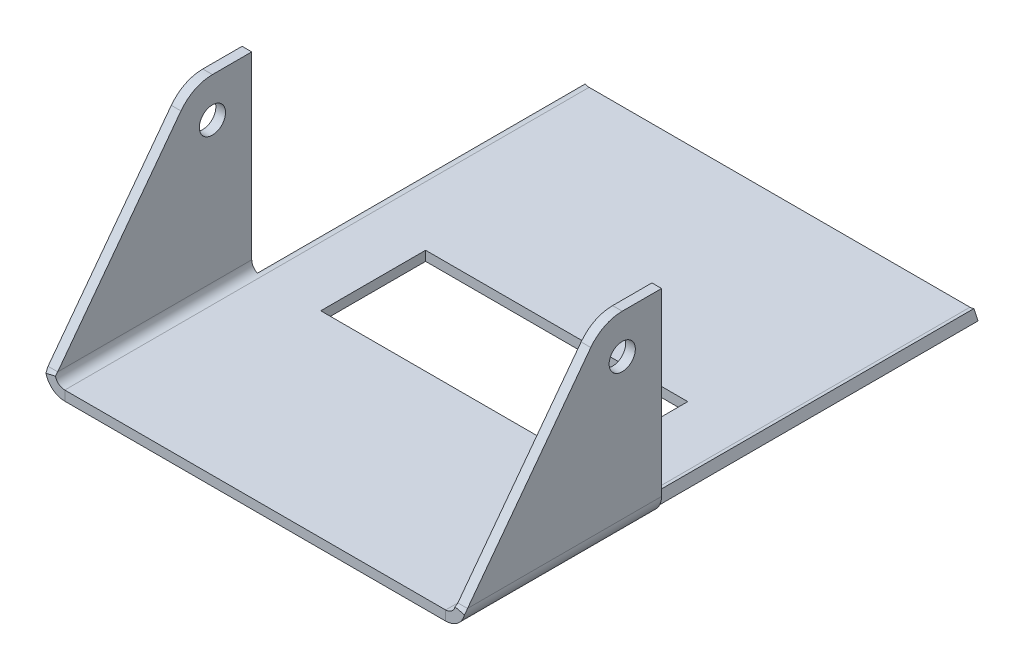
ISO-10303-21;
HEADER;
FILE_DESCRIPTION(('STEP AP214'),'2;1');
FILE_NAME('part.step','',(''),(''),'','','');
FILE_SCHEMA(('AUTOMOTIVE_DESIGN { 1 0 10303 214 1 1 1 1 }'));
ENDSEC;
DATA;
#1=APPLICATION_CONTEXT('core data for automotive mechanical design processes');
#2=APPLICATION_PROTOCOL_DEFINITION('international standard','automotive_design',2000,#1);
#3=PRODUCT_CONTEXT('',#1,'mechanical');
#4=PRODUCT('Part','Part','',(#3));
#5=PRODUCT_RELATED_PRODUCT_CATEGORY('part','',(#4));
#6=PRODUCT_DEFINITION_FORMATION('','',#4);
#7=PRODUCT_DEFINITION_CONTEXT('part definition',#1,'design');
#8=PRODUCT_DEFINITION('design','',#6,#7);
#9=PRODUCT_DEFINITION_SHAPE('','',#8);
#10=(LENGTH_UNIT() NAMED_UNIT(*) SI_UNIT(.MILLI.,.METRE.));
#11=(NAMED_UNIT(*) PLANE_ANGLE_UNIT() SI_UNIT($,.RADIAN.));
#12=(NAMED_UNIT(*) SI_UNIT($,.STERADIAN.) SOLID_ANGLE_UNIT());
#13=UNCERTAINTY_MEASURE_WITH_UNIT(LENGTH_MEASURE(1.E-05),#10,'distance_accuracy_value','');
#14=(GEOMETRIC_REPRESENTATION_CONTEXT(3) GLOBAL_UNCERTAINTY_ASSIGNED_CONTEXT((#13)) GLOBAL_UNIT_ASSIGNED_CONTEXT((#10,
#11,#12)) REPRESENTATION_CONTEXT('',''));
#15=CARTESIAN_POINT('',(0.,0.,0.));
#16=DIRECTION('',(0.,0.,1.));
#17=DIRECTION('',(1.,0.,0.));
#18=AXIS2_PLACEMENT_3D('',#15,#16,#17);
#19=CARTESIAN_POINT('',(27.,-0.7366,-12.));
#20=DIRECTION('',(0.,1.,0.));
#21=DIRECTION('',(0.,0.,1.));
#22=AXIS2_PLACEMENT_3D('',#19,#20,#21);
#23=PLANE('',#22);
#24=DIRECTION('',(-1.,0.,0.));
#25=VECTOR('',#24,1.);
#26=CARTESIAN_POINT('',(-10.,-0.7366,-23.));
#27=LINE('',#26,#25);
#28=CARTESIAN_POINT('',(10.,-0.7366,-23.));
#29=VERTEX_POINT('',#28);
#30=CARTESIAN_POINT('',(-10.,-0.7366,-23.));
#31=VERTEX_POINT('',#30);
#32=EDGE_CURVE('E539',#29,#31,#27,.T.);
#33=ORIENTED_EDGE('',*,*,#32,.T.);
#34=DIRECTION('',(0.,0.,1.));
#35=VECTOR('',#34,1.);
#36=CARTESIAN_POINT('',(-10.,-0.7366,-15.));
#37=LINE('',#36,#35);
#38=CARTESIAN_POINT('',(-10.,-0.7366,-15.));
#39=VERTEX_POINT('',#38);
#40=EDGE_CURVE('E536',#31,#39,#37,.T.);
#41=ORIENTED_EDGE('',*,*,#40,.T.);
#42=DIRECTION('',(1.,0.,0.));
#43=VECTOR('',#42,1.);
#44=CARTESIAN_POINT('',(-10.,-0.7366,-15.));
#45=LINE('',#44,#43);
#46=CARTESIAN_POINT('',(10.,-0.7366,-15.));
#47=VERTEX_POINT('',#46);
#48=EDGE_CURVE('E533',#39,#47,#45,.T.);
#49=ORIENTED_EDGE('',*,*,#48,.T.);
#50=DIRECTION('',(0.,0.,-1.));
#51=VECTOR('',#50,1.);
#52=CARTESIAN_POINT('',(10.,-0.7366,-15.));
#53=LINE('',#52,#51);
#54=EDGE_CURVE('E530',#47,#29,#53,.T.);
#55=ORIENTED_EDGE('',*,*,#54,.T.);
#56=EDGE_LOOP('',(#33,#41,#49,#55));
#57=FACE_BOUND('',#56,.T.);
#58=DIRECTION('',(-1.,0.,0.));
#59=VECTOR('',#58,1.);
#60=CARTESIAN_POINT('',(-15.,-0.7366,-40.));
#61=LINE('',#60,#59);
#62=CARTESIAN_POINT('',(14.5268,-0.7366,-40.));
#63=VERTEX_POINT('',#62);
#64=CARTESIAN_POINT('',(-14.5268,-0.7366,-40.));
#65=VERTEX_POINT('',#64);
#66=EDGE_CURVE('E529',#63,#65,#61,.T.);
#67=ORIENTED_EDGE('',*,*,#66,.F.);
#68=DIRECTION('',(0.,0.,1.));
#69=VECTOR('',#68,1.);
#70=CARTESIAN_POINT('',(14.5268,-0.7366,-12.));
#71=LINE('',#70,#69);
#72=CARTESIAN_POINT('',(14.5268,-0.7366,0.));
#73=VERTEX_POINT('',#72);
#74=EDGE_CURVE('E624',#63,#73,#71,.T.);
#75=ORIENTED_EDGE('',*,*,#74,.T.);
#76=DIRECTION('',(1.,0.,0.));
#77=VECTOR('',#76,1.);
#78=CARTESIAN_POINT('',(-16.,-0.7366,0.));
#79=LINE('',#78,#77);
#80=CARTESIAN_POINT('',(-14.5268,-0.7366,0.));
#81=VERTEX_POINT('',#80);
#82=EDGE_CURVE('E524',#81,#73,#79,.T.);
#83=ORIENTED_EDGE('',*,*,#82,.F.);
#84=DIRECTION('',(0.,0.,1.));
#85=VECTOR('',#84,1.);
#86=CARTESIAN_POINT('',(-14.5268,-0.7366,-12.));
#87=LINE('',#86,#85);
#88=EDGE_CURVE('E562',#65,#81,#87,.T.);
#89=ORIENTED_EDGE('',*,*,#88,.F.);
#90=EDGE_LOOP('',(#67,#75,#83,#89));
#91=FACE_BOUND('',#90,.T.);
#92=ADVANCED_FACE('F55',(#57,#91),#23,.F.);
#93=CARTESIAN_POINT('',(-16.0000000000002,-42.5257728614757,-12.));
#94=DIRECTION('',(1.,0.,0.));
#95=DIRECTION('',(0.,0.,1.));
#96=AXIS2_PLACEMENT_3D('',#93,#94,#95);
#97=PLANE('',#96);
#98=CARTESIAN_POINT('',(-16.,11.4742271385243,-12.));
#99=DIRECTION('',(1.,0.,0.));
#100=DIRECTION('',(0.,0.,1.));
#101=AXIS2_PLACEMENT_3D('',#98,#99,#100);
#102=CIRCLE('',#101,1.);
#103=CARTESIAN_POINT('',(-16.,11.4742271385243,-11.));
#104=VERTEX_POINT('',#103);
#105=EDGE_CURVE('E565',#104,#104,#102,.T.);
#106=ORIENTED_EDGE('',*,*,#105,.T.);
#107=EDGE_LOOP('',(#106));
#108=FACE_BOUND('',#107,.T.);
#109=DIRECTION('',(0.,1.,0.));
#110=VECTOR('',#109,1.);
#111=CARTESIAN_POINT('',(-16.,-0.525772861475685,-15.));
#112=LINE('',#111,#110);
#113=CARTESIAN_POINT('',(-16.,0.736600000000005,-15.));
#114=VERTEX_POINT('',#113);
#115=CARTESIAN_POINT('',(-16.,14.4742271385243,-15.));
#116=VERTEX_POINT('',#115);
#117=EDGE_CURVE('E576',#114,#116,#112,.T.);
#118=ORIENTED_EDGE('',*,*,#117,.F.);
#119=DIRECTION('',(0.,0.,1.));
#120=VECTOR('',#119,1.);
#121=CARTESIAN_POINT('',(-16.,0.736600000000002,-12.));
#122=LINE('',#121,#120);
#123=CARTESIAN_POINT('',(-16.,0.736599999999999,-0.196779646106759));
#124=VERTEX_POINT('',#123);
#125=EDGE_CURVE('E590',#114,#124,#122,.T.);
#126=ORIENTED_EDGE('',*,*,#125,.T.);
#127=DIRECTION('',(0.,-0.8,0.6));
#128=VECTOR('',#127,1.);
#129=CARTESIAN_POINT('',(-16.,13.2742271385243,-9.59999999999999));
#130=LINE('',#129,#128);
#131=CARTESIAN_POINT('',(-16.,13.2742271385243,-9.59999999999999));
#132=VERTEX_POINT('',#131);
#133=EDGE_CURVE('E587',#132,#124,#130,.T.);
#134=ORIENTED_EDGE('',*,*,#133,.F.);
#135=CARTESIAN_POINT('',(-16.,11.4742271385243,-12.));
#136=DIRECTION('',(1.,0.,0.));
#137=DIRECTION('',(0.,0.,-1.));
#138=AXIS2_PLACEMENT_3D('',#135,#136,#137);
#139=CIRCLE('',#138,3.);
#140=CARTESIAN_POINT('',(-16.,14.4742271385243,-12.));
#141=VERTEX_POINT('',#140);
#142=EDGE_CURVE('E575',#141,#132,#139,.T.);
#143=ORIENTED_EDGE('',*,*,#142,.F.);
#144=DIRECTION('',(0.,0.,1.));
#145=VECTOR('',#144,1.);
#146=CARTESIAN_POINT('',(-16.,14.4742271385243,-15.));
#147=LINE('',#146,#145);
#148=EDGE_CURVE('E572',#116,#141,#147,.T.);
#149=ORIENTED_EDGE('',*,*,#148,.F.);
#150=EDGE_LOOP('',(#118,#126,#134,#143,#149));
#151=FACE_BOUND('',#150,.T.);
#152=ADVANCED_FACE('F637',(#108,#151),#97,.F.);
#153=CARTESIAN_POINT('',(-16.,13.2742271385243,-9.59999999999999));
#154=DIRECTION('',(0.,0.6,0.8));
#155=DIRECTION('',(0.,-0.8,0.6));
#156=AXIS2_PLACEMENT_3D('',#153,#154,#155);
#157=PLANE('',#156);
#158=CARTESIAN_POINT('',(-15.2634,0.7366,-0.196779646106766));
#159=CARTESIAN_POINT('',(-16.,0.7366,-0.196779646106766));
#160=B_SPLINE_CURVE_WITH_KNOTS('',1,(#158,#159),.UNSPECIFIED.,.F.,.F.,(2,2),(0.,1.),.UNSPECIFIED.);
#161=CARTESIAN_POINT('',(-15.2634,0.736599999999998,-0.196779646106766));
#162=VERTEX_POINT('',#161);
#163=EDGE_CURVE('E609',#162,#124,#160,.T.);
#164=ORIENTED_EDGE('',*,*,#163,.F.);
#165=DIRECTION('',(0.,-0.8,0.6));
#166=VECTOR('',#165,1.);
#167=CARTESIAN_POINT('',(-15.2634,13.2742271385243,-9.59999999999999));
#168=LINE('',#167,#166);
#169=CARTESIAN_POINT('',(-15.2634,13.2742271385243,-9.59999999999999));
#170=VERTEX_POINT('',#169);
#171=EDGE_CURVE('E568',#170,#162,#168,.T.);
#172=ORIENTED_EDGE('',*,*,#171,.F.);
#173=DIRECTION('',(1.,0.,0.));
#174=VECTOR('',#173,1.);
#175=CARTESIAN_POINT('',(-16.,13.2742271385243,-9.59999999999999));
#176=LINE('',#175,#174);
#177=EDGE_CURVE('E588',#132,#170,#176,.T.);
#178=ORIENTED_EDGE('',*,*,#177,.F.);
#179=ORIENTED_EDGE('',*,*,#133,.T.);
#180=EDGE_LOOP('',(#164,#172,#178,#179));
#181=FACE_BOUND('',#180,.T.);
#182=ADVANCED_FACE('F626',(#181),#157,.T.);
#183=CARTESIAN_POINT('',(-16.,11.4742271385243,-12.));
#184=DIRECTION('',(1.,0.,0.));
#185=DIRECTION('',(0.,0.,1.));
#186=AXIS2_PLACEMENT_3D('',#183,#184,#185);
#187=CYLINDRICAL_SURFACE('',#186,3.);
#188=CARTESIAN_POINT('',(-15.2634,11.4742271385243,-12.));
#189=DIRECTION('',(1.,0.,0.));
#190=DIRECTION('',(0.,0.,-1.));
#191=AXIS2_PLACEMENT_3D('',#188,#189,#190);
#192=CIRCLE('',#191,3.);
#193=CARTESIAN_POINT('',(-15.2634,14.4742271385243,-12.));
#194=VERTEX_POINT('',#193);
#195=EDGE_CURVE('E583',#194,#170,#192,.T.);
#196=ORIENTED_EDGE('',*,*,#195,.F.);
#197=DIRECTION('',(1.,0.,0.));
#198=VECTOR('',#197,1.);
#199=CARTESIAN_POINT('',(-16.,14.4742271385243,-12.));
#200=LINE('',#199,#198);
#201=EDGE_CURVE('E591',#141,#194,#200,.T.);
#202=ORIENTED_EDGE('',*,*,#201,.F.);
#203=ORIENTED_EDGE('',*,*,#142,.T.);
#204=ORIENTED_EDGE('',*,*,#177,.T.);
#205=EDGE_LOOP('',(#196,#202,#203,#204));
#206=FACE_BOUND('',#205,.T.);
#207=ADVANCED_FACE('F636',(#206),#187,.T.);
#208=CARTESIAN_POINT('',(-16.,14.4742271385243,-15.));
#209=DIRECTION('',(0.,1.,0.));
#210=DIRECTION('',(0.,0.,1.));
#211=AXIS2_PLACEMENT_3D('',#208,#209,#210);
#212=PLANE('',#211);
#213=DIRECTION('',(0.,0.,1.));
#214=VECTOR('',#213,1.);
#215=CARTESIAN_POINT('',(-15.2634,14.4742271385243,-15.));
#216=LINE('',#215,#214);
#217=CARTESIAN_POINT('',(-15.2634,14.4742271385243,-15.));
#218=VERTEX_POINT('',#217);
#219=EDGE_CURVE('E580',#218,#194,#216,.T.);
#220=ORIENTED_EDGE('',*,*,#219,.F.);
#221=DIRECTION('',(1.,0.,0.));
#222=VECTOR('',#221,1.);
#223=CARTESIAN_POINT('',(-16.,14.4742271385243,-15.));
#224=LINE('',#223,#222);
#225=EDGE_CURVE('E579',#116,#218,#224,.T.);
#226=ORIENTED_EDGE('',*,*,#225,.F.);
#227=ORIENTED_EDGE('',*,*,#148,.T.);
#228=ORIENTED_EDGE('',*,*,#201,.T.);
#229=EDGE_LOOP('',(#220,#226,#227,#228));
#230=FACE_BOUND('',#229,.T.);
#231=ADVANCED_FACE('F736',(#230),#212,.T.);
#232=CARTESIAN_POINT('',(-16.,-0.525772861475685,-15.));
#233=DIRECTION('',(0.,0.,-1.));
#234=DIRECTION('',(0.,1.,0.));
#235=AXIS2_PLACEMENT_3D('',#232,#233,#234);
#236=PLANE('',#235);
#237=DIRECTION('',(1.,0.,0.));
#238=VECTOR('',#237,1.);
#239=CARTESIAN_POINT('',(-16.,0.736600000000006,-15.));
#240=LINE('',#239,#238);
#241=CARTESIAN_POINT('',(-15.2634,0.736600000000003,-15.));
#242=VERTEX_POINT('',#241);
#243=EDGE_CURVE('E595',#114,#242,#240,.T.);
#244=ORIENTED_EDGE('',*,*,#243,.F.);
#245=ORIENTED_EDGE('',*,*,#117,.T.);
#246=ORIENTED_EDGE('',*,*,#225,.T.);
#247=DIRECTION('',(0.,1.,0.));
#248=VECTOR('',#247,1.);
#249=CARTESIAN_POINT('',(-15.2634,-0.525772861475688,-15.));
#250=LINE('',#249,#248);
#251=EDGE_CURVE('E584',#242,#218,#250,.T.);
#252=ORIENTED_EDGE('',*,*,#251,.F.);
#253=EDGE_LOOP('',(#244,#245,#246,#252));
#254=FACE_BOUND('',#253,.T.);
#255=ADVANCED_FACE('F740',(#254),#236,.T.);
#256=CARTESIAN_POINT('',(-15.2634000000002,-42.5257728614757,-12.));
#257=DIRECTION('',(1.,0.,0.));
#258=DIRECTION('',(0.,0.,1.));
#259=AXIS2_PLACEMENT_3D('',#256,#257,#258);
#260=PLANE('',#259);
#261=DIRECTION('',(0.,0.,1.));
#262=VECTOR('',#261,1.);
#263=CARTESIAN_POINT('',(-15.2634,0.736599999999999,-12.));
#264=LINE('',#263,#262);
#265=EDGE_CURVE('E597',#242,#162,#264,.T.);
#266=ORIENTED_EDGE('',*,*,#265,.F.);
#267=ORIENTED_EDGE('',*,*,#251,.T.);
#268=ORIENTED_EDGE('',*,*,#219,.T.);
#269=ORIENTED_EDGE('',*,*,#195,.T.);
#270=ORIENTED_EDGE('',*,*,#171,.T.);
#271=EDGE_LOOP('',(#266,#267,#268,#269,#270));
#272=FACE_BOUND('',#271,.T.);
#273=CARTESIAN_POINT('',(-15.2634,11.4742271385243,-12.));
#274=DIRECTION('',(1.,0.,0.));
#275=DIRECTION('',(0.,0.,1.));
#276=AXIS2_PLACEMENT_3D('',#273,#274,#275);
#277=CIRCLE('',#276,1.);
#278=CARTESIAN_POINT('',(-15.2634,11.4742271385243,-11.));
#279=VERTEX_POINT('',#278);
#280=EDGE_CURVE('E569',#279,#279,#277,.T.);
#281=ORIENTED_EDGE('',*,*,#280,.F.);
#282=EDGE_LOOP('',(#281));
#283=FACE_BOUND('',#282,.T.);
#284=ADVANCED_FACE('F638',(#272,#283),#260,.T.);
#285=CARTESIAN_POINT('',(-16.,11.4742271385243,-12.));
#286=DIRECTION('',(1.,0.,0.));
#287=DIRECTION('',(0.,0.,1.));
#288=AXIS2_PLACEMENT_3D('',#285,#286,#287);
#289=CYLINDRICAL_SURFACE('',#288,1.);
#290=ORIENTED_EDGE('',*,*,#105,.F.);
#291=EDGE_LOOP('',(#290));
#292=FACE_BOUND('',#291,.T.);
#293=ORIENTED_EDGE('',*,*,#280,.T.);
#294=EDGE_LOOP('',(#293));
#295=FACE_BOUND('',#294,.T.);
#296=ADVANCED_FACE('F807',(#292,#295),#289,.F.);
#297=CARTESIAN_POINT('',(10.,-0.7366,-15.));
#298=DIRECTION('',(1.,0.,0.));
#299=DIRECTION('',(0.,0.,-1.));
#300=AXIS2_PLACEMENT_3D('',#297,#298,#299);
#301=PLANE('',#300);
#302=DIRECTION('',(0.,0.,-1.));
#303=VECTOR('',#302,1.);
#304=CARTESIAN_POINT('',(10.,0.,-15.));
#305=LINE('',#304,#303);
#306=CARTESIAN_POINT('',(10.,0.,-15.));
#307=VERTEX_POINT('',#306);
#308=CARTESIAN_POINT('',(10.,0.,-23.));
#309=VERTEX_POINT('',#308);
#310=EDGE_CURVE('E559',#307,#309,#305,.T.);
#311=ORIENTED_EDGE('',*,*,#310,.T.);
#312=DIRECTION('',(0.,1.,0.));
#313=VECTOR('',#312,1.);
#314=CARTESIAN_POINT('',(10.,-0.7366,-23.));
#315=LINE('',#314,#313);
#316=EDGE_CURVE('E542',#29,#309,#315,.T.);
#317=ORIENTED_EDGE('',*,*,#316,.F.);
#318=ORIENTED_EDGE('',*,*,#54,.F.);
#319=DIRECTION('',(0.,1.,0.));
#320=VECTOR('',#319,1.);
#321=CARTESIAN_POINT('',(10.,-0.7366,-15.));
#322=LINE('',#321,#320);
#323=EDGE_CURVE('E557',#47,#307,#322,.T.);
#324=ORIENTED_EDGE('',*,*,#323,.T.);
#325=EDGE_LOOP('',(#311,#317,#318,#324));
#326=FACE_BOUND('',#325,.T.);
#327=ADVANCED_FACE('F475',(#326),#301,.F.);
#328=CARTESIAN_POINT('',(-10.,-0.7366,-15.));
#329=DIRECTION('',(0.,0.,1.));
#330=DIRECTION('',(1.,0.,0.));
#331=AXIS2_PLACEMENT_3D('',#328,#329,#330);
#332=PLANE('',#331);
#333=DIRECTION('',(1.,0.,0.));
#334=VECTOR('',#333,1.);
#335=CARTESIAN_POINT('',(-10.,0.,-15.));
#336=LINE('',#335,#334);
#337=CARTESIAN_POINT('',(-10.,0.,-15.));
#338=VERTEX_POINT('',#337);
#339=EDGE_CURVE('E554',#338,#307,#336,.T.);
#340=ORIENTED_EDGE('',*,*,#339,.T.);
#341=ORIENTED_EDGE('',*,*,#323,.F.);
#342=ORIENTED_EDGE('',*,*,#48,.F.);
#343=DIRECTION('',(0.,1.,0.));
#344=VECTOR('',#343,1.);
#345=CARTESIAN_POINT('',(-10.,-0.7366,-15.));
#346=LINE('',#345,#344);
#347=EDGE_CURVE('E551',#39,#338,#346,.T.);
#348=ORIENTED_EDGE('',*,*,#347,.T.);
#349=EDGE_LOOP('',(#340,#341,#342,#348));
#350=FACE_BOUND('',#349,.T.);
#351=ADVANCED_FACE('F793',(#350),#332,.F.);
#352=CARTESIAN_POINT('',(-10.,-0.7366,-15.));
#353=DIRECTION('',(-1.,0.,0.));
#354=DIRECTION('',(0.,0.,1.));
#355=AXIS2_PLACEMENT_3D('',#352,#353,#354);
#356=PLANE('',#355);
#357=DIRECTION('',(0.,0.,1.));
#358=VECTOR('',#357,1.);
#359=CARTESIAN_POINT('',(-10.,0.,-15.));
#360=LINE('',#359,#358);
#361=CARTESIAN_POINT('',(-10.,0.,-23.));
#362=VERTEX_POINT('',#361);
#363=EDGE_CURVE('E549',#362,#338,#360,.T.);
#364=ORIENTED_EDGE('',*,*,#363,.T.);
#365=ORIENTED_EDGE('',*,*,#347,.F.);
#366=ORIENTED_EDGE('',*,*,#40,.F.);
#367=DIRECTION('',(0.,1.,0.));
#368=VECTOR('',#367,1.);
#369=CARTESIAN_POINT('',(-10.,-0.7366,-23.));
#370=LINE('',#369,#368);
#371=EDGE_CURVE('E547',#31,#362,#370,.T.);
#372=ORIENTED_EDGE('',*,*,#371,.T.);
#373=EDGE_LOOP('',(#364,#365,#366,#372));
#374=FACE_BOUND('',#373,.T.);
#375=ADVANCED_FACE('F785',(#374),#356,.F.);
#376=CARTESIAN_POINT('',(-10.,-0.7366,-23.));
#377=DIRECTION('',(0.,0.,-1.));
#378=DIRECTION('',(-1.,0.,0.));
#379=AXIS2_PLACEMENT_3D('',#376,#377,#378);
#380=PLANE('',#379);
#381=DIRECTION('',(-1.,0.,0.));
#382=VECTOR('',#381,1.);
#383=CARTESIAN_POINT('',(-10.,0.,-23.));
#384=LINE('',#383,#382);
#385=EDGE_CURVE('E544',#309,#362,#384,.T.);
#386=ORIENTED_EDGE('',*,*,#385,.T.);
#387=ORIENTED_EDGE('',*,*,#371,.F.);
#388=ORIENTED_EDGE('',*,*,#32,.F.);
#389=ORIENTED_EDGE('',*,*,#316,.T.);
#390=EDGE_LOOP('',(#386,#387,#388,#389));
#391=FACE_BOUND('',#390,.T.);
#392=ADVANCED_FACE('F643',(#391),#380,.F.);
#393=CARTESIAN_POINT('',(-15.,-0.7366,-40.));
#394=DIRECTION('',(0.,0.,-1.));
#395=DIRECTION('',(-1.,0.,0.));
#396=AXIS2_PLACEMENT_3D('',#393,#394,#395);
#397=PLANE('',#396);
#398=DIRECTION('',(0.,1.,0.));
#399=VECTOR('',#398,1.);
#400=CARTESIAN_POINT('',(14.5268,-0.7366,-40.));
#401=LINE('',#400,#399);
#402=CARTESIAN_POINT('',(14.5268,0.,-40.));
#403=VERTEX_POINT('',#402);
#404=EDGE_CURVE('E663',#63,#403,#401,.T.);
#405=ORIENTED_EDGE('',*,*,#404,.F.);
#406=ORIENTED_EDGE('',*,*,#66,.T.);
#407=DIRECTION('',(0.,1.,0.));
#408=VECTOR('',#407,1.);
#409=CARTESIAN_POINT('',(-14.5268,-0.7366,-40.));
#410=LINE('',#409,#408);
#411=CARTESIAN_POINT('',(-14.5268,0.,-40.));
#412=VERTEX_POINT('',#411);
#413=EDGE_CURVE('E527',#65,#412,#410,.T.);
#414=ORIENTED_EDGE('',*,*,#413,.T.);
#415=DIRECTION('',(-1.,0.,0.));
#416=VECTOR('',#415,1.);
#417=CARTESIAN_POINT('',(-15.,0.,-40.));
#418=LINE('',#417,#416);
#419=EDGE_CURVE('E82',#403,#412,#418,.T.);
#420=ORIENTED_EDGE('',*,*,#419,.F.);
#421=EDGE_LOOP('',(#405,#406,#414,#420));
#422=FACE_BOUND('',#421,.T.);
#423=ADVANCED_FACE('F640',(#422),#397,.T.);
#424=CARTESIAN_POINT('',(27.,0.,-12.));
#425=DIRECTION('',(0.,1.,0.));
#426=DIRECTION('',(0.,0.,1.));
#427=AXIS2_PLACEMENT_3D('',#424,#425,#426);
#428=PLANE('',#427);
#429=DIRECTION('',(0.,0.,1.));
#430=VECTOR('',#429,1.);
#431=CARTESIAN_POINT('',(14.5268,0.,-12.));
#432=LINE('',#431,#430);
#433=CARTESIAN_POINT('',(14.5268,0.,0.));
#434=VERTEX_POINT('',#433);
#435=EDGE_CURVE('E66',#403,#434,#432,.T.);
#436=ORIENTED_EDGE('',*,*,#435,.F.);
#437=ORIENTED_EDGE('',*,*,#419,.T.);
#438=DIRECTION('',(0.,0.,1.));
#439=VECTOR('',#438,1.);
#440=CARTESIAN_POINT('',(-14.5268,0.,-12.));
#441=LINE('',#440,#439);
#442=CARTESIAN_POINT('',(-14.5268,0.,0.));
#443=VERTEX_POINT('',#442);
#444=EDGE_CURVE('E525',#412,#443,#441,.T.);
#445=ORIENTED_EDGE('',*,*,#444,.T.);
#446=DIRECTION('',(1.,0.,0.));
#447=VECTOR('',#446,1.);
#448=CARTESIAN_POINT('',(-16.,0.,0.));
#449=LINE('',#448,#447);
#450=EDGE_CURVE('E74',#443,#434,#449,.T.);
#451=ORIENTED_EDGE('',*,*,#450,.T.);
#452=EDGE_LOOP('',(#436,#437,#445,#451));
#453=FACE_BOUND('',#452,.T.);
#454=ORIENTED_EDGE('',*,*,#363,.F.);
#455=ORIENTED_EDGE('',*,*,#385,.F.);
#456=ORIENTED_EDGE('',*,*,#310,.F.);
#457=ORIENTED_EDGE('',*,*,#339,.F.);
#458=EDGE_LOOP('',(#454,#455,#456,#457));
#459=FACE_BOUND('',#458,.T.);
#460=ADVANCED_FACE('F57',(#453,#459),#428,.T.);
#461=CARTESIAN_POINT('',(-16.,-0.7366,0.));
#462=DIRECTION('',(0.,0.,1.));
#463=DIRECTION('',(1.,0.,0.));
#464=AXIS2_PLACEMENT_3D('',#461,#462,#463);
#465=PLANE('',#464);
#466=DIRECTION('',(0.,-1.,0.));
#467=VECTOR('',#466,1.);
#468=CARTESIAN_POINT('',(14.5268,-0.7366,0.));
#469=LINE('',#468,#467);
#470=EDGE_CURVE('E12',#434,#73,#469,.T.);
#471=ORIENTED_EDGE('',*,*,#470,.F.);
#472=ORIENTED_EDGE('',*,*,#450,.F.);
#473=DIRECTION('',(0.,-1.,0.));
#474=VECTOR('',#473,1.);
#475=CARTESIAN_POINT('',(-14.5268,-0.7366,0.));
#476=LINE('',#475,#474);
#477=EDGE_CURVE('E516',#443,#81,#476,.T.);
#478=ORIENTED_EDGE('',*,*,#477,.T.);
#479=ORIENTED_EDGE('',*,*,#82,.T.);
#480=EDGE_LOOP('',(#471,#472,#478,#479));
#481=FACE_BOUND('',#480,.T.);
#482=ADVANCED_FACE('F644',(#481),#465,.T.);
#483=CARTESIAN_POINT('',(-14.5268,0.7366,-15.));
#484=DIRECTION('',(0.,0.,-1.));
#485=DIRECTION('',(-1.,0.,0.));
#486=AXIS2_PLACEMENT_3D('',#483,#484,#485);
#487=PLANE('',#486);
#488=ORIENTED_EDGE('',*,*,#243,.T.);
#489=CARTESIAN_POINT('',(-14.5268,0.7366,-15.));
#490=DIRECTION('',(0.,0.,-1.));
#491=DIRECTION('',(-1.,0.,0.));
#492=AXIS2_PLACEMENT_3D('',#489,#490,#491);
#493=CIRCLE('',#492,0.7366);
#494=CARTESIAN_POINT('',(-14.8327109778263,0.0665268445569861,-15.));
#495=VERTEX_POINT('',#494);
#496=EDGE_CURVE('E389',#242,#495,#493,.F.);
#497=ORIENTED_EDGE('',*,*,#496,.T.);
#498=DIRECTION('',(-0.41530135463793,-0.90968389280887,0.));
#499=VECTOR('',#498,1.);
#500=CARTESIAN_POINT('',(-15.1386219556526,-0.603546310886028,-15.));
#501=LINE('',#500,#499);
#502=CARTESIAN_POINT('',(-15.1386219556526,-0.603546310886028,-15.));
#503=VERTEX_POINT('',#502);
#504=EDGE_CURVE('E564',#495,#503,#501,.T.);
#505=ORIENTED_EDGE('',*,*,#504,.T.);
#506=CARTESIAN_POINT('',(-14.5268,0.7366,-15.));
#507=DIRECTION('',(0.,0.,1.));
#508=DIRECTION('',(-1.,0.,0.));
#509=AXIS2_PLACEMENT_3D('',#506,#507,#508);
#510=CIRCLE('',#509,1.4732);
#511=EDGE_CURVE('E391',#114,#503,#510,.T.);
#512=ORIENTED_EDGE('',*,*,#511,.F.);
#513=EDGE_LOOP('',(#488,#497,#505,#512));
#514=FACE_BOUND('',#513,.T.);
#515=ADVANCED_FACE('F473',(#514),#487,.T.);
#516=CARTESIAN_POINT('',(-15.1386219556526,-0.603546310886029,-27.5));
#517=DIRECTION('',(-0.909683892808871,0.415301354637928,0.));
#518=DIRECTION('',(0.,0.,-1.));
#519=AXIS2_PLACEMENT_3D('',#516,#517,#518);
#520=PLANE('',#519);
#521=ORIENTED_EDGE('',*,*,#504,.F.);
#522=DIRECTION('',(0.,0.,-1.));
#523=VECTOR('',#522,1.);
#524=CARTESIAN_POINT('',(-14.8327109778263,0.0665268445569855,20.0444102555836));
#525=LINE('',#524,#523);
#526=CARTESIAN_POINT('',(-14.8327109778263,0.0665268445569847,-40.));
#527=VERTEX_POINT('',#526);
#528=EDGE_CURVE('E406',#495,#527,#525,.T.);
#529=ORIENTED_EDGE('',*,*,#528,.T.);
#530=DIRECTION('',(-0.415301354637926,-0.909683892808872,0.));
#531=VECTOR('',#530,1.);
#532=CARTESIAN_POINT('',(-15.1386219556526,-0.60354631088603,-40.));
#533=LINE('',#532,#531);
#534=CARTESIAN_POINT('',(-15.1386219556526,-0.60354631088603,-40.));
#535=VERTEX_POINT('',#534);
#536=EDGE_CURVE('E747',#527,#535,#533,.T.);
#537=ORIENTED_EDGE('',*,*,#536,.T.);
#538=DIRECTION('',(0.,0.,-1.));
#539=VECTOR('',#538,1.);
#540=CARTESIAN_POINT('',(-15.1386219556526,-0.60354631088603,-40.));
#541=LINE('',#540,#539);
#542=EDGE_CURVE('E394',#503,#535,#541,.T.);
#543=ORIENTED_EDGE('',*,*,#542,.F.);
#544=EDGE_LOOP('',(#521,#529,#537,#543));
#545=FACE_BOUND('',#544,.T.);
#546=ADVANCED_FACE('F745',(#545),#520,.T.);
#547=CARTESIAN_POINT('',(-14.5268,0.7366,-40.));
#548=DIRECTION('',(0.,0.,-1.));
#549=DIRECTION('',(-1.,0.,0.));
#550=AXIS2_PLACEMENT_3D('',#547,#548,#549);
#551=PLANE('',#550);
#552=ORIENTED_EDGE('',*,*,#536,.F.);
#553=CARTESIAN_POINT('',(-14.5268,0.7366,-40.));
#554=DIRECTION('',(0.,0.,-1.));
#555=DIRECTION('',(-1.,0.,0.));
#556=AXIS2_PLACEMENT_3D('',#553,#554,#555);
#557=CIRCLE('',#556,0.7366);
#558=EDGE_CURVE('E402',#527,#412,#557,.F.);
#559=ORIENTED_EDGE('',*,*,#558,.T.);
#560=ORIENTED_EDGE('',*,*,#413,.F.);
#561=CARTESIAN_POINT('',(-14.5268,0.7366,-40.));
#562=DIRECTION('',(0.,0.,1.));
#563=DIRECTION('',(-1.,0.,0.));
#564=AXIS2_PLACEMENT_3D('',#561,#562,#563);
#565=CIRCLE('',#564,1.4732);
#566=EDGE_CURVE('E398',#535,#65,#565,.T.);
#567=ORIENTED_EDGE('',*,*,#566,.F.);
#568=EDGE_LOOP('',(#552,#559,#560,#567));
#569=FACE_BOUND('',#568,.T.);
#570=ADVANCED_FACE('F754',(#569),#551,.T.);
#571=CARTESIAN_POINT('',(-14.5268,0.7366,0.));
#572=DIRECTION('',(0.,0.,1.));
#573=DIRECTION('',(1.,0.,0.));
#574=AXIS2_PLACEMENT_3D('',#571,#572,#573);
#575=PLANE('',#574);
#576=ORIENTED_EDGE('',*,*,#477,.F.);
#577=CARTESIAN_POINT('',(-14.5268,0.7366,0.));
#578=DIRECTION('',(0.,0.,-1.));
#579=DIRECTION('',(-1.,0.,0.));
#580=AXIS2_PLACEMENT_3D('',#577,#578,#579);
#581=CIRCLE('',#580,0.7366);
#582=CARTESIAN_POINT('',(-15.2427294581442,0.563324003505018,0.));
#583=VERTEX_POINT('',#582);
#584=EDGE_CURVE('E405',#443,#583,#581,.T.);
#585=ORIENTED_EDGE('',*,*,#584,.T.);
#586=CARTESIAN_POINT('',(-15.9586589162884,0.390048007010035,0.));
#587=CARTESIAN_POINT('',(-15.2427294581442,0.563324003505017,0.));
#588=B_SPLINE_CURVE_WITH_KNOTS('',1,(#586,#587),.UNSPECIFIED.,.F.,.F.,(2,2),(0.,1.),.UNSPECIFIED.);
#589=CARTESIAN_POINT('',(-15.9586589162884,0.390048007010037,0.));
#590=VERTEX_POINT('',#589);
#591=EDGE_CURVE('E503',#583,#590,#588,.F.);
#592=ORIENTED_EDGE('',*,*,#591,.T.);
#593=CARTESIAN_POINT('',(-14.5268,0.7366,0.));
#594=DIRECTION('',(0.,0.,-1.));
#595=DIRECTION('',(1.,0.,0.));
#596=AXIS2_PLACEMENT_3D('',#593,#594,#595);
#597=CIRCLE('',#596,1.4732);
#598=EDGE_CURVE('E401',#81,#590,#597,.T.);
#599=ORIENTED_EDGE('',*,*,#598,.F.);
#600=EDGE_LOOP('',(#576,#585,#592,#599));
#601=FACE_BOUND('',#600,.T.);
#602=ADVANCED_FACE('F428',(#601),#575,.T.);
#603=CARTESIAN_POINT('',(-15.9586589162884,0.390048007010035,0.));
#604=CARTESIAN_POINT('',(-15.9860919140766,0.503393719278448,-0.0655977743655773));
#605=CARTESIAN_POINT('',(-16.,0.619981734461199,-0.131181871741189));
#606=CARTESIAN_POINT('',(-16.,0.7366,-0.196779646106766));
#607=CARTESIAN_POINT('',(-15.2427294581442,0.563324003505017,0.));
#608=CARTESIAN_POINT('',(-15.2564455720309,0.619995268892984,-0.0655959331064624));
#609=CARTESIAN_POINT('',(-15.2634,0.678292503905369,-0.131183713000304));
#610=CARTESIAN_POINT('',(-15.2634,0.7366,-0.196779646106766));
#611=B_SPLINE_SURFACE_WITH_KNOTS('',1,3,((#603,#604,#605,#606),(#607,#608,#609,#610)),
.UNSPECIFIED.,.F.,.F.,.F.,(2,2),(4,4),(0.,1.),(0.,1.),.UNSPECIFIED.);
#612=CARTESIAN_POINT('',(-15.2427294581442,0.563324003505017,0.));
#613=CARTESIAN_POINT('',(-15.2564455720309,0.619995268892984,-0.0655959331064624));
#614=CARTESIAN_POINT('',(-15.2634,0.678292503905369,-0.131183713000304));
#615=CARTESIAN_POINT('',(-15.2634,0.7366,-0.196779646106766));
#616=B_SPLINE_CURVE_WITH_KNOTS('',3,(#612,#613,#614,#615),.UNSPECIFIED.,.F.,.F.,(4,4),(0.,1.),.UNSPECIFIED.);
#617=EDGE_CURVE('E395',#583,#162,#616,.T.);
#618=CARTESIAN_POINT('',(-16.,0.7366,-0.196779646106766));
#619=CARTESIAN_POINT('',(-16.,0.619981734461199,-0.131181871741189));
#620=CARTESIAN_POINT('',(-15.9860919140766,0.503393719278448,-0.0655977743655773));
#621=CARTESIAN_POINT('',(-15.9586589162884,0.390048007010035,0.));
#622=B_SPLINE_CURVE_WITH_KNOTS('',3,(#618,#619,#620,#621),.UNSPECIFIED.,.F.,.F.,(4,4),(0.,1.),.UNSPECIFIED.);
#623=EDGE_CURVE('E455',#590,#124,#622,.F.);
#624=ORIENTED_EDGE('',*,*,#617,.T.);
#625=ORIENTED_EDGE('',*,*,#163,.T.);
#626=ORIENTED_EDGE('',*,*,#623,.F.);
#627=ORIENTED_EDGE('',*,*,#591,.F.);
#628=EDGE_LOOP('',(#624,#625,#626,#627));
#629=FACE_BOUND('',#628,.T.);
#630=ADVANCED_FACE('F426',(#629),#611,.T.);
#631=CARTESIAN_POINT('',(-14.5268,0.7366,20.0444102555836));
#632=DIRECTION('',(0.,0.,-1.));
#633=DIRECTION('',(-1.,0.,0.));
#634=AXIS2_PLACEMENT_3D('',#631,#632,#633);
#635=CYLINDRICAL_SURFACE('',#634,1.4732);
#636=ORIENTED_EDGE('',*,*,#598,.T.);
#637=ORIENTED_EDGE('',*,*,#623,.T.);
#638=ORIENTED_EDGE('',*,*,#125,.F.);
#639=ORIENTED_EDGE('',*,*,#511,.T.);
#640=ORIENTED_EDGE('',*,*,#542,.T.);
#641=ORIENTED_EDGE('',*,*,#566,.T.);
#642=ORIENTED_EDGE('',*,*,#88,.T.);
#643=EDGE_LOOP('',(#636,#637,#638,#639,#640,#641,#642));
#644=FACE_BOUND('',#643,.T.);
#645=ADVANCED_FACE('F416',(#644),#635,.T.);
#646=CARTESIAN_POINT('',(-14.5268,0.7366,20.0444102555836));
#647=DIRECTION('',(0.,0.,-1.));
#648=DIRECTION('',(-1.,0.,0.));
#649=AXIS2_PLACEMENT_3D('',#646,#647,#648);
#650=CYLINDRICAL_SURFACE('',#649,0.7366);
#651=ORIENTED_EDGE('',*,*,#584,.F.);
#652=ORIENTED_EDGE('',*,*,#444,.F.);
#653=ORIENTED_EDGE('',*,*,#558,.F.);
#654=ORIENTED_EDGE('',*,*,#528,.F.);
#655=ORIENTED_EDGE('',*,*,#496,.F.);
#656=ORIENTED_EDGE('',*,*,#265,.T.);
#657=ORIENTED_EDGE('',*,*,#617,.F.);
#658=EDGE_LOOP('',(#651,#652,#653,#654,#655,#656,#657));
#659=FACE_BOUND('',#658,.T.);
#660=ADVANCED_FACE('F425',(#659),#650,.F.);
#661=CARTESIAN_POINT('',(14.5268,0.7366,-15.));
#662=DIRECTION('',(0.,0.,-1.));
#663=DIRECTION('',(-1.,0.,0.));
#664=AXIS2_PLACEMENT_3D('',#661,#662,#663);
#665=PLANE('',#664);
#666=DIRECTION('',(0.41530135463793,-0.90968389280887,0.));
#667=VECTOR('',#666,1.);
#668=CARTESIAN_POINT('',(15.1386219556526,-0.603546310886028,-15.));
#669=LINE('',#668,#667);
#670=CARTESIAN_POINT('',(14.8327109778263,0.0665268445569861,-15.));
#671=VERTEX_POINT('',#670);
#672=CARTESIAN_POINT('',(15.1386219556526,-0.603546310886028,-15.));
#673=VERTEX_POINT('',#672);
#674=EDGE_CURVE('E382',#671,#673,#669,.T.);
#675=ORIENTED_EDGE('',*,*,#674,.F.);
#676=CARTESIAN_POINT('',(14.5268,0.7366,-15.));
#677=DIRECTION('',(0.,0.,1.));
#678=DIRECTION('',(1.,0.,0.));
#679=AXIS2_PLACEMENT_3D('',#676,#677,#678);
#680=CIRCLE('',#679,0.7366);
#681=CARTESIAN_POINT('',(15.2634,0.736600000000002,-15.));
#682=VERTEX_POINT('',#681);
#683=EDGE_CURVE('E239',#671,#682,#680,.T.);
#684=ORIENTED_EDGE('',*,*,#683,.T.);
#685=DIRECTION('',(-1.,0.,0.));
#686=VECTOR('',#685,1.);
#687=CARTESIAN_POINT('',(16.,0.736600000000006,-15.));
#688=LINE('',#687,#686);
#689=CARTESIAN_POINT('',(16.,0.736600000000006,-15.));
#690=VERTEX_POINT('',#689);
#691=EDGE_CURVE('E676',#690,#682,#688,.T.);
#692=ORIENTED_EDGE('',*,*,#691,.F.);
#693=CARTESIAN_POINT('',(14.5268,0.7366,-15.));
#694=DIRECTION('',(0.,0.,1.));
#695=DIRECTION('',(-1.,0.,0.));
#696=AXIS2_PLACEMENT_3D('',#693,#694,#695);
#697=CIRCLE('',#696,1.4732);
#698=EDGE_CURVE('E256',#673,#690,#697,.T.);
#699=ORIENTED_EDGE('',*,*,#698,.F.);
#700=EDGE_LOOP('',(#675,#684,#692,#699));
#701=FACE_BOUND('',#700,.T.);
#702=ADVANCED_FACE('F342',(#701),#665,.T.);
#703=CARTESIAN_POINT('',(16.,0.7366,-0.196779646106794));
#704=CARTESIAN_POINT('',(16.,0.619981734461196,-0.131181871741216));
#705=CARTESIAN_POINT('',(15.9860919140766,0.503393719278438,-0.0655977743656025));
#706=CARTESIAN_POINT('',(15.9586589162884,0.390048007010029,0.));
#707=CARTESIAN_POINT('',(15.2634,0.7366,-0.196779646106801));
#708=CARTESIAN_POINT('',(15.2634,0.678292503905363,-0.131183713000334));
#709=CARTESIAN_POINT('',(15.2564455720309,0.61999526889298,-0.0655959331064958));
#710=CARTESIAN_POINT('',(15.2427294581442,0.563324003505014,0.));
#711=B_SPLINE_SURFACE_WITH_KNOTS('',1,3,((#703,#704,#705,#706),(#707,#708,#709,#710)),
.UNSPECIFIED.,.F.,.F.,.F.,(2,2),(4,4),(0.,1.),(0.,1.),.UNSPECIFIED.);
#712=CARTESIAN_POINT('',(16.,0.7366,-0.196779646106794));
#713=CARTESIAN_POINT('',(15.2634,0.7366,-0.196779646106801));
#714=B_SPLINE_CURVE_WITH_KNOTS('',1,(#712,#713),.UNSPECIFIED.,.F.,.F.,(2,2),(0.,1.),.UNSPECIFIED.);
#715=CARTESIAN_POINT('',(15.2634,0.736600000000002,-0.196779646106767));
#716=VERTEX_POINT('',#715);
#717=CARTESIAN_POINT('',(16.,0.736600000000003,-0.19677964610678));
#718=VERTEX_POINT('',#717);
#719=EDGE_CURVE('E228',#716,#718,#714,.F.);
#720=CARTESIAN_POINT('',(15.2634,0.7366,-0.196779646106801));
#721=CARTESIAN_POINT('',(15.2634,0.678292503905363,-0.131183713000334));
#722=CARTESIAN_POINT('',(15.2564455720309,0.61999526889298,-0.0655959331064958));
#723=CARTESIAN_POINT('',(15.2427294581442,0.563324003505014,0.));
#724=B_SPLINE_CURVE_WITH_KNOTS('',3,(#720,#721,#722,#723),.UNSPECIFIED.,.F.,.F.,(4,4),(0.,1.),.UNSPECIFIED.);
#725=CARTESIAN_POINT('',(15.2427294581442,0.563324003505015,0.));
#726=VERTEX_POINT('',#725);
#727=EDGE_CURVE('E275',#716,#726,#724,.T.);
#728=CARTESIAN_POINT('',(15.2427294581442,0.563324003505014,0.));
#729=CARTESIAN_POINT('',(15.9586589162884,0.390048007010029,0.));
#730=B_SPLINE_CURVE_WITH_KNOTS('',1,(#728,#729),.UNSPECIFIED.,.F.,.F.,(2,2),(0.,1.),.UNSPECIFIED.);
#731=CARTESIAN_POINT('',(15.9586589162884,0.390048007010029,0.));
#732=VERTEX_POINT('',#731);
#733=EDGE_CURVE('E369',#726,#732,#730,.T.);
#734=CARTESIAN_POINT('',(15.9586589162884,0.390048007010029,0.));
#735=CARTESIAN_POINT('',(15.9860919140766,0.503393719278438,-0.0655977743656025));
#736=CARTESIAN_POINT('',(16.,0.619981734461196,-0.131181871741216));
#737=CARTESIAN_POINT('',(16.,0.7366,-0.196779646106794));
#738=B_SPLINE_CURVE_WITH_KNOTS('',3,(#734,#735,#736,#737),.UNSPECIFIED.,.F.,.F.,(4,4),(0.,1.),.UNSPECIFIED.);
#739=EDGE_CURVE('E259',#718,#732,#738,.F.);
#740=ORIENTED_EDGE('',*,*,#719,.F.);
#741=ORIENTED_EDGE('',*,*,#727,.T.);
#742=ORIENTED_EDGE('',*,*,#733,.T.);
#743=ORIENTED_EDGE('',*,*,#739,.F.);
#744=EDGE_LOOP('',(#740,#741,#742,#743));
#745=FACE_BOUND('',#744,.T.);
#746=ADVANCED_FACE('F330',(#745),#711,.T.);
#747=CARTESIAN_POINT('',(14.5268,0.7366,0.));
#748=DIRECTION('',(0.,0.,1.));
#749=DIRECTION('',(0.,-1.,0.));
#750=AXIS2_PLACEMENT_3D('',#747,#748,#749);
#751=PLANE('',#750);
#752=ORIENTED_EDGE('',*,*,#733,.F.);
#753=CARTESIAN_POINT('',(14.5268,0.7366,0.));
#754=DIRECTION('',(0.,0.,1.));
#755=DIRECTION('',(1.,0.,0.));
#756=AXIS2_PLACEMENT_3D('',#753,#754,#755);
#757=CIRCLE('',#756,0.7366);
#758=EDGE_CURVE('E272',#726,#434,#757,.F.);
#759=ORIENTED_EDGE('',*,*,#758,.T.);
#760=ORIENTED_EDGE('',*,*,#470,.T.);
#761=CARTESIAN_POINT('',(14.5268,0.7366,0.));
#762=DIRECTION('',(0.,0.,-1.));
#763=DIRECTION('',(0.,-1.,0.));
#764=AXIS2_PLACEMENT_3D('',#761,#762,#763);
#765=CIRCLE('',#764,1.4732);
#766=EDGE_CURVE('E265',#732,#73,#765,.T.);
#767=ORIENTED_EDGE('',*,*,#766,.F.);
#768=EDGE_LOOP('',(#752,#759,#760,#767));
#769=FACE_BOUND('',#768,.T.);
#770=ADVANCED_FACE('F341',(#769),#751,.T.);
#771=CARTESIAN_POINT('',(14.5268,0.7366,-40.));
#772=DIRECTION('',(0.,0.,-1.));
#773=DIRECTION('',(-1.,0.,0.));
#774=AXIS2_PLACEMENT_3D('',#771,#772,#773);
#775=PLANE('',#774);
#776=ORIENTED_EDGE('',*,*,#404,.T.);
#777=CARTESIAN_POINT('',(14.5268,0.7366,-40.));
#778=DIRECTION('',(0.,0.,1.));
#779=DIRECTION('',(1.,0.,0.));
#780=AXIS2_PLACEMENT_3D('',#777,#778,#779);
#781=CIRCLE('',#780,0.7366);
#782=CARTESIAN_POINT('',(14.8327109778263,0.0665268445569861,-40.));
#783=VERTEX_POINT('',#782);
#784=EDGE_CURVE('E269',#403,#783,#781,.T.);
#785=ORIENTED_EDGE('',*,*,#784,.T.);
#786=DIRECTION('',(0.41530135463793,-0.90968389280887,0.));
#787=VECTOR('',#786,1.);
#788=CARTESIAN_POINT('',(15.1386219556526,-0.603546310886027,-40.));
#789=LINE('',#788,#787);
#790=CARTESIAN_POINT('',(15.1386219556526,-0.603546310886027,-40.));
#791=VERTEX_POINT('',#790);
#792=EDGE_CURVE('E268',#783,#791,#789,.T.);
#793=ORIENTED_EDGE('',*,*,#792,.T.);
#794=CARTESIAN_POINT('',(14.5268,0.7366,-40.));
#795=DIRECTION('',(0.,0.,1.));
#796=DIRECTION('',(-1.,0.,0.));
#797=AXIS2_PLACEMENT_3D('',#794,#795,#796);
#798=CIRCLE('',#797,1.4732);
#799=EDGE_CURVE('E261',#63,#791,#798,.T.);
#800=ORIENTED_EDGE('',*,*,#799,.F.);
#801=EDGE_LOOP('',(#776,#785,#793,#800));
#802=FACE_BOUND('',#801,.T.);
#803=ADVANCED_FACE('F300',(#802),#775,.T.);
#804=CARTESIAN_POINT('',(15.1386219556526,-0.603546310886028,-27.5));
#805=DIRECTION('',(0.90968389280887,0.41530135463793,0.));
#806=DIRECTION('',(0.,0.,1.));
#807=AXIS2_PLACEMENT_3D('',#804,#805,#806);
#808=PLANE('',#807);
#809=DIRECTION('',(0.,0.,1.));
#810=VECTOR('',#809,1.);
#811=CARTESIAN_POINT('',(14.8327109778263,0.0665268445569861,-60.0444102555836));
#812=LINE('',#811,#810);
#813=EDGE_CURVE('E260',#783,#671,#812,.T.);
#814=ORIENTED_EDGE('',*,*,#813,.T.);
#815=ORIENTED_EDGE('',*,*,#674,.T.);
#816=DIRECTION('',(0.,0.,1.));
#817=VECTOR('',#816,1.);
#818=CARTESIAN_POINT('',(15.1386219556526,-0.603546310886028,-15.));
#819=LINE('',#818,#817);
#820=EDGE_CURVE('E264',#791,#673,#819,.T.);
#821=ORIENTED_EDGE('',*,*,#820,.F.);
#822=ORIENTED_EDGE('',*,*,#792,.F.);
#823=EDGE_LOOP('',(#814,#815,#821,#822));
#824=FACE_BOUND('',#823,.T.);
#825=ADVANCED_FACE('F298',(#824),#808,.T.);
#826=CARTESIAN_POINT('',(14.5268,0.7366,-60.0444102555836));
#827=DIRECTION('',(0.,0.,1.));
#828=DIRECTION('',(1.,0.,0.));
#829=AXIS2_PLACEMENT_3D('',#826,#827,#828);
#830=CYLINDRICAL_SURFACE('',#829,1.4732);
#831=ORIENTED_EDGE('',*,*,#799,.T.);
#832=ORIENTED_EDGE('',*,*,#820,.T.);
#833=ORIENTED_EDGE('',*,*,#698,.T.);
#834=DIRECTION('',(0.,0.,1.));
#835=VECTOR('',#834,1.);
#836=CARTESIAN_POINT('',(16.,0.736600000000006,-12.));
#837=LINE('',#836,#835);
#838=EDGE_CURVE('E252',#690,#718,#837,.T.);
#839=ORIENTED_EDGE('',*,*,#838,.T.);
#840=ORIENTED_EDGE('',*,*,#739,.T.);
#841=ORIENTED_EDGE('',*,*,#766,.T.);
#842=ORIENTED_EDGE('',*,*,#74,.F.);
#843=EDGE_LOOP('',(#831,#832,#833,#839,#840,#841,#842));
#844=FACE_BOUND('',#843,.T.);
#845=ADVANCED_FACE('F288',(#844),#830,.T.);
#846=CARTESIAN_POINT('',(14.5268,0.7366,-60.0444102555836));
#847=DIRECTION('',(0.,0.,1.));
#848=DIRECTION('',(1.,0.,0.));
#849=AXIS2_PLACEMENT_3D('',#846,#847,#848);
#850=CYLINDRICAL_SURFACE('',#849,0.7366);
#851=ORIENTED_EDGE('',*,*,#784,.F.);
#852=ORIENTED_EDGE('',*,*,#435,.T.);
#853=ORIENTED_EDGE('',*,*,#758,.F.);
#854=ORIENTED_EDGE('',*,*,#727,.F.);
#855=DIRECTION('',(0.,0.,1.));
#856=VECTOR('',#855,1.);
#857=CARTESIAN_POINT('',(15.2634,0.736600000000002,-12.));
#858=LINE('',#857,#856);
#859=EDGE_CURVE('E684',#682,#716,#858,.T.);
#860=ORIENTED_EDGE('',*,*,#859,.F.);
#861=ORIENTED_EDGE('',*,*,#683,.F.);
#862=ORIENTED_EDGE('',*,*,#813,.F.);
#863=EDGE_LOOP('',(#851,#852,#853,#854,#860,#861,#862));
#864=FACE_BOUND('',#863,.T.);
#865=ADVANCED_FACE('F297',(#864),#850,.F.);
#866=CARTESIAN_POINT('',(16.,11.4742271385243,-12.));
#867=DIRECTION('',(-1.,0.,0.));
#868=DIRECTION('',(0.,0.,1.));
#869=AXIS2_PLACEMENT_3D('',#866,#867,#868);
#870=CYLINDRICAL_SURFACE('',#869,1.);
#871=CARTESIAN_POINT('',(16.,11.4742271385243,-12.));
#872=DIRECTION('',(-1.,0.,0.));
#873=DIRECTION('',(0.,0.,1.));
#874=AXIS2_PLACEMENT_3D('',#871,#872,#873);
#875=CIRCLE('',#874,1.);
#876=CARTESIAN_POINT('',(16.,11.4742271385243,-11.));
#877=VERTEX_POINT('',#876);
#878=EDGE_CURVE('E686',#877,#877,#875,.T.);
#879=ORIENTED_EDGE('',*,*,#878,.F.);
#880=EDGE_LOOP('',(#879));
#881=FACE_BOUND('',#880,.T.);
#882=CARTESIAN_POINT('',(15.2634,11.4742271385243,-12.));
#883=DIRECTION('',(-1.,0.,0.));
#884=DIRECTION('',(0.,0.,1.));
#885=AXIS2_PLACEMENT_3D('',#882,#883,#884);
#886=CIRCLE('',#885,1.);
#887=CARTESIAN_POINT('',(15.2634,11.4742271385243,-11.));
#888=VERTEX_POINT('',#887);
#889=EDGE_CURVE('E248',#888,#888,#886,.T.);
#890=ORIENTED_EDGE('',*,*,#889,.T.);
#891=EDGE_LOOP('',(#890));
#892=FACE_BOUND('',#891,.T.);
#893=ADVANCED_FACE('F306',(#881,#892),#870,.F.);
#894=CARTESIAN_POINT('',(16.,11.4742271385243,-12.));
#895=DIRECTION('',(-1.,0.,0.));
#896=DIRECTION('',(0.,0.,1.));
#897=AXIS2_PLACEMENT_3D('',#894,#895,#896);
#898=CYLINDRICAL_SURFACE('',#897,3.00000000000001);
#899=CARTESIAN_POINT('',(15.2634,11.4742271385243,-12.));
#900=DIRECTION('',(-1.,0.,0.));
#901=DIRECTION('',(0.,0.,1.));
#902=AXIS2_PLACEMENT_3D('',#899,#900,#901);
#903=CIRCLE('',#902,3.00000000000001);
#904=CARTESIAN_POINT('',(15.2634,13.2742271385243,-9.59999999999999));
#905=VERTEX_POINT('',#904);
#906=CARTESIAN_POINT('',(15.2634,14.4742271385243,-12.));
#907=VERTEX_POINT('',#906);
#908=EDGE_CURVE('E238',#905,#907,#903,.T.);
#909=ORIENTED_EDGE('',*,*,#908,.F.);
#910=DIRECTION('',(-1.,0.,0.));
#911=VECTOR('',#910,1.);
#912=CARTESIAN_POINT('',(16.,13.2742271385243,-9.59999999999999));
#913=LINE('',#912,#911);
#914=CARTESIAN_POINT('',(16.,13.2742271385243,-9.59999999999999));
#915=VERTEX_POINT('',#914);
#916=EDGE_CURVE('E225',#915,#905,#913,.T.);
#917=ORIENTED_EDGE('',*,*,#916,.F.);
#918=CARTESIAN_POINT('',(16.,11.4742271385243,-12.));
#919=DIRECTION('',(-1.,0.,0.));
#920=DIRECTION('',(0.,0.,1.));
#921=AXIS2_PLACEMENT_3D('',#918,#919,#920);
#922=CIRCLE('',#921,3.00000000000001);
#923=CARTESIAN_POINT('',(16.,14.4742271385243,-12.));
#924=VERTEX_POINT('',#923);
#925=EDGE_CURVE('E236',#915,#924,#922,.T.);
#926=ORIENTED_EDGE('',*,*,#925,.T.);
#927=DIRECTION('',(-1.,0.,0.));
#928=VECTOR('',#927,1.);
#929=CARTESIAN_POINT('',(16.,14.4742271385243,-12.));
#930=LINE('',#929,#928);
#931=EDGE_CURVE('E247',#924,#907,#930,.T.);
#932=ORIENTED_EDGE('',*,*,#931,.T.);
#933=EDGE_LOOP('',(#909,#917,#926,#932));
#934=FACE_BOUND('',#933,.T.);
#935=ADVANCED_FACE('F235',(#934),#898,.T.);
#936=CARTESIAN_POINT('',(16.,14.4742271385243,-12.));
#937=DIRECTION('',(0.,1.,0.));
#938=DIRECTION('',(0.,0.,-1.));
#939=AXIS2_PLACEMENT_3D('',#936,#937,#938);
#940=PLANE('',#939);
#941=DIRECTION('',(0.,0.,-1.));
#942=VECTOR('',#941,1.);
#943=CARTESIAN_POINT('',(15.2634,14.4742271385243,-12.));
#944=LINE('',#943,#942);
#945=CARTESIAN_POINT('',(15.2634,14.4742271385243,-15.));
#946=VERTEX_POINT('',#945);
#947=EDGE_CURVE('E697',#907,#946,#944,.T.);
#948=ORIENTED_EDGE('',*,*,#947,.F.);
#949=ORIENTED_EDGE('',*,*,#931,.F.);
#950=DIRECTION('',(0.,0.,-1.));
#951=VECTOR('',#950,1.);
#952=CARTESIAN_POINT('',(16.,14.4742271385243,-12.));
#953=LINE('',#952,#951);
#954=CARTESIAN_POINT('',(16.,14.4742271385243,-15.));
#955=VERTEX_POINT('',#954);
#956=EDGE_CURVE('E246',#924,#955,#953,.T.);
#957=ORIENTED_EDGE('',*,*,#956,.T.);
#958=DIRECTION('',(-1.,0.,0.));
#959=VECTOR('',#958,1.);
#960=CARTESIAN_POINT('',(16.,14.4742271385243,-15.));
#961=LINE('',#960,#959);
#962=EDGE_CURVE('E692',#955,#946,#961,.T.);
#963=ORIENTED_EDGE('',*,*,#962,.T.);
#964=EDGE_LOOP('',(#948,#949,#957,#963));
#965=FACE_BOUND('',#964,.T.);
#966=ADVANCED_FACE('F695',(#965),#940,.T.);
#967=CARTESIAN_POINT('',(16.,11.4742271385243,-12.));
#968=DIRECTION('',(-1.,0.,0.));
#969=DIRECTION('',(0.,0.,1.));
#970=AXIS2_PLACEMENT_3D('',#967,#968,#969);
#971=PLANE('',#970);
#972=ORIENTED_EDGE('',*,*,#838,.F.);
#973=DIRECTION('',(0.,-1.,0.));
#974=VECTOR('',#973,1.);
#975=CARTESIAN_POINT('',(16.,14.4742271385243,-15.));
#976=LINE('',#975,#974);
#977=EDGE_CURVE('E682',#955,#690,#976,.T.);
#978=ORIENTED_EDGE('',*,*,#977,.F.);
#979=ORIENTED_EDGE('',*,*,#956,.F.);
#980=ORIENTED_EDGE('',*,*,#925,.F.);
#981=DIRECTION('',(0.,0.8,-0.6));
#982=VECTOR('',#981,1.);
#983=CARTESIAN_POINT('',(16.,0.474227138524316,0.));
#984=LINE('',#983,#982);
#985=EDGE_CURVE('E222',#718,#915,#984,.T.);
#986=ORIENTED_EDGE('',*,*,#985,.F.);
#987=EDGE_LOOP('',(#972,#978,#979,#980,#986));
#988=FACE_BOUND('',#987,.T.);
#989=ORIENTED_EDGE('',*,*,#878,.T.);
#990=EDGE_LOOP('',(#989));
#991=FACE_BOUND('',#990,.T.);
#992=ADVANCED_FACE('F242',(#988,#991),#971,.F.);
#993=CARTESIAN_POINT('',(16.,14.4742271385243,-15.));
#994=DIRECTION('',(0.,0.,-1.));
#995=DIRECTION('',(0.,-1.,0.));
#996=AXIS2_PLACEMENT_3D('',#993,#994,#995);
#997=PLANE('',#996);
#998=ORIENTED_EDGE('',*,*,#977,.T.);
#999=ORIENTED_EDGE('',*,*,#691,.T.);
#1000=DIRECTION('',(0.,-1.,0.));
#1001=VECTOR('',#1000,1.);
#1002=CARTESIAN_POINT('',(15.2634,14.4742271385243,-15.));
#1003=LINE('',#1002,#1001);
#1004=EDGE_CURVE('E681',#946,#682,#1003,.T.);
#1005=ORIENTED_EDGE('',*,*,#1004,.F.);
#1006=ORIENTED_EDGE('',*,*,#962,.F.);
#1007=EDGE_LOOP('',(#998,#999,#1005,#1006));
#1008=FACE_BOUND('',#1007,.T.);
#1009=ADVANCED_FACE('F945',(#1008),#997,.T.);
#1010=CARTESIAN_POINT('',(15.2634,11.4742271385243,-12.));
#1011=DIRECTION('',(-1.,0.,0.));
#1012=DIRECTION('',(0.,0.,1.));
#1013=AXIS2_PLACEMENT_3D('',#1010,#1011,#1012);
#1014=PLANE('',#1013);
#1015=ORIENTED_EDGE('',*,*,#889,.F.);
#1016=EDGE_LOOP('',(#1015));
#1017=FACE_BOUND('',#1016,.T.);
#1018=ORIENTED_EDGE('',*,*,#1004,.T.);
#1019=ORIENTED_EDGE('',*,*,#859,.T.);
#1020=DIRECTION('',(0.,0.8,-0.6));
#1021=VECTOR('',#1020,1.);
#1022=CARTESIAN_POINT('',(15.2634,0.474227138524312,0.));
#1023=LINE('',#1022,#1021);
#1024=EDGE_CURVE('E702',#716,#905,#1023,.T.);
#1025=ORIENTED_EDGE('',*,*,#1024,.T.);
#1026=ORIENTED_EDGE('',*,*,#908,.T.);
#1027=ORIENTED_EDGE('',*,*,#947,.T.);
#1028=EDGE_LOOP('',(#1018,#1019,#1025,#1026,#1027));
#1029=FACE_BOUND('',#1028,.T.);
#1030=ADVANCED_FACE('F700',(#1017,#1029),#1014,.T.);
#1031=CARTESIAN_POINT('',(16.,0.474227138524316,0.));
#1032=DIRECTION('',(0.,0.599999999999999,0.8));
#1033=DIRECTION('',(0.,0.800000000000001,-0.6));
#1034=AXIS2_PLACEMENT_3D('',#1031,#1032,#1033);
#1035=PLANE('',#1034);
#1036=ORIENTED_EDGE('',*,*,#1024,.F.);
#1037=ORIENTED_EDGE('',*,*,#719,.T.);
#1038=ORIENTED_EDGE('',*,*,#985,.T.);
#1039=ORIENTED_EDGE('',*,*,#916,.T.);
#1040=EDGE_LOOP('',(#1036,#1037,#1038,#1039));
#1041=FACE_BOUND('',#1040,.T.);
#1042=ADVANCED_FACE('F224',(#1041),#1035,.T.);
#1043=CLOSED_SHELL('',(#92,#152,#182,#207,#231,#255,#284,#296,#327,#351,#375,#392,#423,#460,
#482,#515,#546,#570,#602,#630,#645,#660,#702,#746,#770,#803,#825,#845,#865,#893,#935,#966,#992,
#1009,#1030,#1042));
#1044=MANIFOLD_SOLID_BREP('B2',#1043);
#1045=ADVANCED_BREP_SHAPE_REPRESENTATION('',(#18,#1044),#14);
#1046=SHAPE_DEFINITION_REPRESENTATION(#9,#1045);
ENDSEC;
END-ISO-10303-21;
